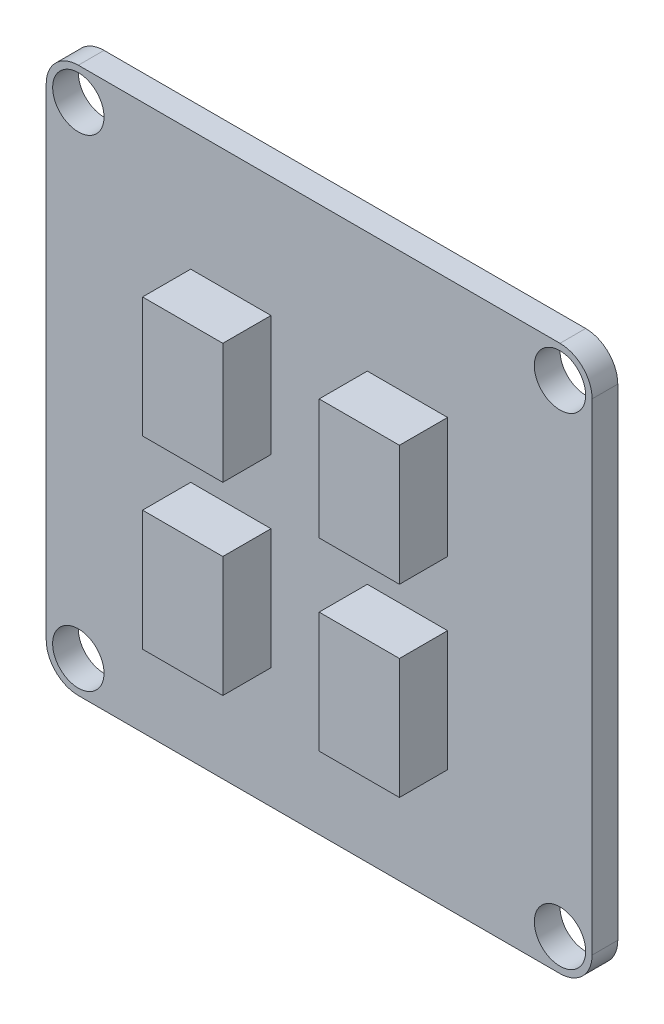
ISO-10303-21;
HEADER;
FILE_DESCRIPTION(('STEP AP214'),'2;1');
FILE_NAME('part.step','',(''),(''),'','','');
FILE_SCHEMA(('AUTOMOTIVE_DESIGN { 1 0 10303 214 1 1 1 1 }'));
ENDSEC;
DATA;
#1=APPLICATION_CONTEXT('core data for automotive mechanical design processes');
#2=APPLICATION_PROTOCOL_DEFINITION('international standard','automotive_design',2000,#1);
#3=PRODUCT_CONTEXT('',#1,'mechanical');
#4=PRODUCT('Part','Part','',(#3));
#5=PRODUCT_RELATED_PRODUCT_CATEGORY('part','',(#4));
#6=PRODUCT_DEFINITION_FORMATION('','',#4);
#7=PRODUCT_DEFINITION_CONTEXT('part definition',#1,'design');
#8=PRODUCT_DEFINITION('design','',#6,#7);
#9=PRODUCT_DEFINITION_SHAPE('','',#8);
#10=(LENGTH_UNIT() NAMED_UNIT(*) SI_UNIT(.MILLI.,.METRE.));
#11=(NAMED_UNIT(*) PLANE_ANGLE_UNIT() SI_UNIT($,.RADIAN.));
#12=(NAMED_UNIT(*) SI_UNIT($,.STERADIAN.) SOLID_ANGLE_UNIT());
#13=UNCERTAINTY_MEASURE_WITH_UNIT(LENGTH_MEASURE(1.E-05),#10,'distance_accuracy_value','');
#14=(GEOMETRIC_REPRESENTATION_CONTEXT(3) GLOBAL_UNCERTAINTY_ASSIGNED_CONTEXT((#13)) GLOBAL_UNIT_ASSIGNED_CONTEXT((#10,
#11,#12)) REPRESENTATION_CONTEXT('',''));
#15=CARTESIAN_POINT('',(0.,0.,0.));
#16=DIRECTION('',(0.,0.,1.));
#17=DIRECTION('',(1.,0.,0.));
#18=AXIS2_PLACEMENT_3D('',#15,#16,#17);
#19=CARTESIAN_POINT('',(-13.2356576243425,11.611622238612,1.6));
#20=DIRECTION('',(0.,0.,1.));
#21=DIRECTION('',(1.,0.,0.));
#22=AXIS2_PLACEMENT_3D('',#19,#20,#21);
#23=PLANE('',#22);
#24=CARTESIAN_POINT('',(-13.2356576243425,11.611622238612,1.6));
#25=DIRECTION('',(0.,0.,1.));
#26=DIRECTION('',(-1.,0.,0.));
#27=AXIS2_PLACEMENT_3D('',#24,#25,#26);
#28=CIRCLE('',#27,1.6);
#29=CARTESIAN_POINT('',(-14.8356576243425,11.611622238612,1.6));
#30=VERTEX_POINT('',#29);
#31=EDGE_CURVE('E318',#30,#30,#28,.T.);
#32=ORIENTED_EDGE('',*,*,#31,.F.);
#33=EDGE_LOOP('',(#32));
#34=FACE_BOUND('',#33,.T.);
#35=CARTESIAN_POINT('',(16.7643423756575,11.611622238612,1.6));
#36=DIRECTION('',(0.,0.,1.));
#37=DIRECTION('',(1.,0.,0.));
#38=AXIS2_PLACEMENT_3D('',#35,#36,#37);
#39=CIRCLE('',#38,1.6);
#40=CARTESIAN_POINT('',(18.3643423756575,11.611622238612,1.6));
#41=VERTEX_POINT('',#40);
#42=EDGE_CURVE('E330',#41,#41,#39,.T.);
#43=ORIENTED_EDGE('',*,*,#42,.F.);
#44=EDGE_LOOP('',(#43));
#45=FACE_BOUND('',#44,.T.);
#46=CARTESIAN_POINT('',(-13.2356576243425,11.611622238612,1.6));
#47=DIRECTION('',(0.,0.,1.));
#48=DIRECTION('',(1.,0.,0.));
#49=AXIS2_PLACEMENT_3D('',#46,#47,#48);
#50=CIRCLE('',#49,2.);
#51=CARTESIAN_POINT('',(-13.2356576243425,13.611622238612,1.6));
#52=VERTEX_POINT('',#51);
#53=CARTESIAN_POINT('',(-15.2356576243425,11.611622238612,1.6));
#54=VERTEX_POINT('',#53);
#55=EDGE_CURVE('E336',#52,#54,#50,.T.);
#56=ORIENTED_EDGE('',*,*,#55,.T.);
#57=DIRECTION('',(0.,-1.,0.));
#58=VECTOR('',#57,1.);
#59=CARTESIAN_POINT('',(-15.2356576243425,11.611622238612,1.6));
#60=LINE('',#59,#58);
#61=CARTESIAN_POINT('',(-15.2356576243425,-18.388377761388,1.6));
#62=VERTEX_POINT('',#61);
#63=EDGE_CURVE('E339',#54,#62,#60,.T.);
#64=ORIENTED_EDGE('',*,*,#63,.T.);
#65=CARTESIAN_POINT('',(-13.2356576243425,-18.388377761388,1.6));
#66=DIRECTION('',(0.,0.,1.));
#67=DIRECTION('',(1.,0.,0.));
#68=AXIS2_PLACEMENT_3D('',#65,#66,#67);
#69=CIRCLE('',#68,2.);
#70=CARTESIAN_POINT('',(-13.2356576243425,-20.388377761388,1.6));
#71=VERTEX_POINT('',#70);
#72=EDGE_CURVE('E342',#62,#71,#69,.T.);
#73=ORIENTED_EDGE('',*,*,#72,.T.);
#74=DIRECTION('',(1.,0.,0.));
#75=VECTOR('',#74,1.);
#76=CARTESIAN_POINT('',(-13.2356576243425,-20.388377761388,1.6));
#77=LINE('',#76,#75);
#78=CARTESIAN_POINT('',(16.7643423756575,-20.388377761388,1.6));
#79=VERTEX_POINT('',#78);
#80=EDGE_CURVE('E344',#71,#79,#77,.T.);
#81=ORIENTED_EDGE('',*,*,#80,.T.);
#82=CARTESIAN_POINT('',(16.7643423756575,-18.388377761388,1.6));
#83=DIRECTION('',(0.,0.,1.));
#84=DIRECTION('',(1.,0.,0.));
#85=AXIS2_PLACEMENT_3D('',#82,#83,#84);
#86=CIRCLE('',#85,2.);
#87=CARTESIAN_POINT('',(18.7643423756575,-18.388377761388,1.6));
#88=VERTEX_POINT('',#87);
#89=EDGE_CURVE('E346',#79,#88,#86,.T.);
#90=ORIENTED_EDGE('',*,*,#89,.T.);
#91=DIRECTION('',(0.,1.,0.));
#92=VECTOR('',#91,1.);
#93=CARTESIAN_POINT('',(18.7643423756575,11.611622238612,1.6));
#94=LINE('',#93,#92);
#95=CARTESIAN_POINT('',(18.7643423756575,11.611622238612,1.6));
#96=VERTEX_POINT('',#95);
#97=EDGE_CURVE('E348',#88,#96,#94,.T.);
#98=ORIENTED_EDGE('',*,*,#97,.T.);
#99=CARTESIAN_POINT('',(16.7643423756575,11.611622238612,1.6));
#100=DIRECTION('',(0.,0.,1.));
#101=DIRECTION('',(-1.,0.,0.));
#102=AXIS2_PLACEMENT_3D('',#99,#100,#101);
#103=CIRCLE('',#102,2.);
#104=CARTESIAN_POINT('',(16.7643423756575,13.611622238612,1.6));
#105=VERTEX_POINT('',#104);
#106=EDGE_CURVE('E350',#96,#105,#103,.T.);
#107=ORIENTED_EDGE('',*,*,#106,.T.);
#108=DIRECTION('',(-1.,0.,0.));
#109=VECTOR('',#108,1.);
#110=CARTESIAN_POINT('',(-13.2356576243425,13.611622238612,1.6));
#111=LINE('',#110,#109);
#112=EDGE_CURVE('E352',#105,#52,#111,.T.);
#113=ORIENTED_EDGE('',*,*,#112,.T.);
#114=EDGE_LOOP('',(#56,#64,#73,#81,#90,#98,#107,#113));
#115=FACE_BOUND('',#114,.T.);
#116=CARTESIAN_POINT('',(16.7643423756575,-18.388377761388,1.6));
#117=DIRECTION('',(0.,0.,1.));
#118=DIRECTION('',(-1.,0.,0.));
#119=AXIS2_PLACEMENT_3D('',#116,#117,#118);
#120=CIRCLE('',#119,1.6);
#121=CARTESIAN_POINT('',(15.1643423756575,-18.388377761388,1.6));
#122=VERTEX_POINT('',#121);
#123=EDGE_CURVE('E324',#122,#122,#120,.T.);
#124=ORIENTED_EDGE('',*,*,#123,.F.);
#125=EDGE_LOOP('',(#124));
#126=FACE_BOUND('',#125,.T.);
#127=CARTESIAN_POINT('',(-13.2356576243425,-18.388377761388,1.6));
#128=DIRECTION('',(0.,0.,1.));
#129=DIRECTION('',(1.,0.,0.));
#130=AXIS2_PLACEMENT_3D('',#127,#128,#129);
#131=CIRCLE('',#130,1.6);
#132=CARTESIAN_POINT('',(-11.6356576243425,-18.388377761388,1.6));
#133=VERTEX_POINT('',#132);
#134=EDGE_CURVE('E312',#133,#133,#131,.T.);
#135=ORIENTED_EDGE('',*,*,#134,.F.);
#136=EDGE_LOOP('',(#135));
#137=FACE_BOUND('',#136,.T.);
#138=DIRECTION('',(-1.,0.,0.));
#139=VECTOR('',#138,1.);
#140=CARTESIAN_POINT('',(9.76434237565751,6.11162223861203,1.6));
#141=LINE('',#140,#139);
#142=CARTESIAN_POINT('',(9.76434237565751,6.11162223861203,1.6));
#143=VERTEX_POINT('',#142);
#144=CARTESIAN_POINT('',(4.76434237565751,6.11162223861203,1.6));
#145=VERTEX_POINT('',#144);
#146=EDGE_CURVE('E296',#143,#145,#141,.T.);
#147=ORIENTED_EDGE('',*,*,#146,.F.);
#148=DIRECTION('',(0.,1.,0.));
#149=VECTOR('',#148,1.);
#150=CARTESIAN_POINT('',(9.76434237565751,6.11162223861203,1.6));
#151=LINE('',#150,#149);
#152=CARTESIAN_POINT('',(9.76434237565751,-1.38837776138797,1.6));
#153=VERTEX_POINT('',#152);
#154=EDGE_CURVE('E282',#153,#143,#151,.T.);
#155=ORIENTED_EDGE('',*,*,#154,.F.);
#156=DIRECTION('',(1.,0.,0.));
#157=VECTOR('',#156,1.);
#158=CARTESIAN_POINT('',(9.76434237565751,-1.38837776138797,1.6));
#159=LINE('',#158,#157);
#160=CARTESIAN_POINT('',(4.76434237565751,-1.38837776138796,1.6));
#161=VERTEX_POINT('',#160);
#162=EDGE_CURVE('E287',#161,#153,#159,.T.);
#163=ORIENTED_EDGE('',*,*,#162,.F.);
#164=DIRECTION('',(0.,-1.,0.));
#165=VECTOR('',#164,1.);
#166=CARTESIAN_POINT('',(4.76434237565751,6.11162223861203,1.6));
#167=LINE('',#166,#165);
#168=EDGE_CURVE('E298',#145,#161,#167,.T.);
#169=ORIENTED_EDGE('',*,*,#168,.F.);
#170=EDGE_LOOP('',(#147,#155,#163,#169));
#171=FACE_BOUND('',#170,.T.);
#172=DIRECTION('',(-1.,0.,0.));
#173=VECTOR('',#172,1.);
#174=CARTESIAN_POINT('',(9.76434237565751,-5.38837776138797,1.6));
#175=LINE('',#174,#173);
#176=CARTESIAN_POINT('',(9.76434237565751,-5.38837776138797,1.6));
#177=VERTEX_POINT('',#176);
#178=CARTESIAN_POINT('',(4.76434237565751,-5.38837776138797,1.6));
#179=VERTEX_POINT('',#178);
#180=EDGE_CURVE('E267',#177,#179,#175,.T.);
#181=ORIENTED_EDGE('',*,*,#180,.F.);
#182=DIRECTION('',(0.,1.,0.));
#183=VECTOR('',#182,1.);
#184=CARTESIAN_POINT('',(9.76434237565751,-5.38837776138797,1.6));
#185=LINE('',#184,#183);
#186=CARTESIAN_POINT('',(9.76434237565751,-12.888377761388,1.6));
#187=VERTEX_POINT('',#186);
#188=EDGE_CURVE('E253',#187,#177,#185,.T.);
#189=ORIENTED_EDGE('',*,*,#188,.F.);
#190=DIRECTION('',(1.,0.,0.));
#191=VECTOR('',#190,1.);
#192=CARTESIAN_POINT('',(9.76434237565751,-12.888377761388,1.6));
#193=LINE('',#192,#191);
#194=CARTESIAN_POINT('',(4.76434237565751,-12.888377761388,1.6));
#195=VERTEX_POINT('',#194);
#196=EDGE_CURVE('E258',#195,#187,#193,.T.);
#197=ORIENTED_EDGE('',*,*,#196,.F.);
#198=DIRECTION('',(0.,-1.,0.));
#199=VECTOR('',#198,1.);
#200=CARTESIAN_POINT('',(4.76434237565751,-5.38837776138797,1.6));
#201=LINE('',#200,#199);
#202=EDGE_CURVE('E269',#179,#195,#201,.T.);
#203=ORIENTED_EDGE('',*,*,#202,.F.);
#204=EDGE_LOOP('',(#181,#189,#197,#203));
#205=FACE_BOUND('',#204,.T.);
#206=DIRECTION('',(0.,-1.,0.));
#207=VECTOR('',#206,1.);
#208=CARTESIAN_POINT('',(-6.23565762434249,-5.38837776138797,1.6));
#209=LINE('',#208,#207);
#210=CARTESIAN_POINT('',(-6.23565762434249,-5.38837776138797,1.6));
#211=VERTEX_POINT('',#210);
#212=CARTESIAN_POINT('',(-6.23565762434249,-12.888377761388,1.6));
#213=VERTEX_POINT('',#212);
#214=EDGE_CURVE('E225',#211,#213,#209,.T.);
#215=ORIENTED_EDGE('',*,*,#214,.F.);
#216=DIRECTION('',(-1.,0.,0.));
#217=VECTOR('',#216,1.);
#218=CARTESIAN_POINT('',(-6.23565762434249,-5.38837776138797,1.6));
#219=LINE('',#218,#217);
#220=CARTESIAN_POINT('',(-1.23565762434249,-5.38837776138797,1.6));
#221=VERTEX_POINT('',#220);
#222=EDGE_CURVE('E222',#221,#211,#219,.T.);
#223=ORIENTED_EDGE('',*,*,#222,.F.);
#224=DIRECTION('',(0.,1.,0.));
#225=VECTOR('',#224,1.);
#226=CARTESIAN_POINT('',(-1.23565762434249,-5.38837776138797,1.6));
#227=LINE('',#226,#225);
#228=CARTESIAN_POINT('',(-1.23565762434249,-12.888377761388,1.6));
#229=VERTEX_POINT('',#228);
#230=EDGE_CURVE('E234',#229,#221,#227,.T.);
#231=ORIENTED_EDGE('',*,*,#230,.F.);
#232=DIRECTION('',(1.,0.,0.));
#233=VECTOR('',#232,1.);
#234=CARTESIAN_POINT('',(-6.23565762434249,-12.888377761388,1.6));
#235=LINE('',#234,#233);
#236=EDGE_CURVE('E242',#213,#229,#235,.T.);
#237=ORIENTED_EDGE('',*,*,#236,.F.);
#238=EDGE_LOOP('',(#215,#223,#231,#237));
#239=FACE_BOUND('',#238,.T.);
#240=DIRECTION('',(0.,-1.,0.));
#241=VECTOR('',#240,1.);
#242=CARTESIAN_POINT('',(-6.23565762434249,6.11162223861203,1.6));
#243=LINE('',#242,#241);
#244=CARTESIAN_POINT('',(-6.23565762434249,6.11162223861203,1.6));
#245=VERTEX_POINT('',#244);
#246=CARTESIAN_POINT('',(-6.23565762434249,-1.38837776138797,1.6));
#247=VERTEX_POINT('',#246);
#248=EDGE_CURVE('E759',#245,#247,#243,.T.);
#249=ORIENTED_EDGE('',*,*,#248,.F.);
#250=DIRECTION('',(-1.,0.,0.));
#251=VECTOR('',#250,1.);
#252=CARTESIAN_POINT('',(-6.23565762434249,6.11162223861203,1.6));
#253=LINE('',#252,#251);
#254=CARTESIAN_POINT('',(-1.23565762434249,6.11162223861203,1.6));
#255=VERTEX_POINT('',#254);
#256=EDGE_CURVE('E220',#255,#245,#253,.T.);
#257=ORIENTED_EDGE('',*,*,#256,.F.);
#258=DIRECTION('',(0.,1.,0.));
#259=VECTOR('',#258,1.);
#260=CARTESIAN_POINT('',(-1.23565762434249,6.11162223861203,1.6));
#261=LINE('',#260,#259);
#262=CARTESIAN_POINT('',(-1.23565762434249,-1.38837776138797,1.6));
#263=VERTEX_POINT('',#262);
#264=EDGE_CURVE('E216',#263,#255,#261,.T.);
#265=ORIENTED_EDGE('',*,*,#264,.F.);
#266=DIRECTION('',(1.,0.,0.));
#267=VECTOR('',#266,1.);
#268=CARTESIAN_POINT('',(-6.23565762434249,-1.38837776138797,1.6));
#269=LINE('',#268,#267);
#270=EDGE_CURVE('E756',#247,#263,#269,.T.);
#271=ORIENTED_EDGE('',*,*,#270,.F.);
#272=EDGE_LOOP('',(#249,#257,#265,#271));
#273=FACE_BOUND('',#272,.T.);
#274=ADVANCED_FACE('F35',(#34,#45,#115,#126,#137,#171,#205,#239,#273),#23,.T.);
#275=CARTESIAN_POINT('',(-13.2356576243425,11.611622238612,0.));
#276=DIRECTION('',(0.,0.,1.));
#277=DIRECTION('',(1.,0.,0.));
#278=AXIS2_PLACEMENT_3D('',#275,#276,#277);
#279=PLANE('',#278);
#280=CARTESIAN_POINT('',(-13.2356576243425,11.611622238612,0.));
#281=DIRECTION('',(0.,0.,1.));
#282=DIRECTION('',(1.,0.,0.));
#283=AXIS2_PLACEMENT_3D('',#280,#281,#282);
#284=CIRCLE('',#283,2.);
#285=CARTESIAN_POINT('',(-13.2356576243425,13.611622238612,0.));
#286=VERTEX_POINT('',#285);
#287=CARTESIAN_POINT('',(-15.2356576243425,11.611622238612,0.));
#288=VERTEX_POINT('',#287);
#289=EDGE_CURVE('E333',#286,#288,#284,.T.);
#290=ORIENTED_EDGE('',*,*,#289,.F.);
#291=DIRECTION('',(-1.,0.,0.));
#292=VECTOR('',#291,1.);
#293=CARTESIAN_POINT('',(-13.2356576243425,13.611622238612,0.));
#294=LINE('',#293,#292);
#295=CARTESIAN_POINT('',(16.7643423756575,13.611622238612,0.));
#296=VERTEX_POINT('',#295);
#297=EDGE_CURVE('E340',#296,#286,#294,.T.);
#298=ORIENTED_EDGE('',*,*,#297,.F.);
#299=CARTESIAN_POINT('',(16.7643423756575,11.611622238612,0.));
#300=DIRECTION('',(0.,0.,1.));
#301=DIRECTION('',(-1.,0.,0.));
#302=AXIS2_PLACEMENT_3D('',#299,#300,#301);
#303=CIRCLE('',#302,2.);
#304=CARTESIAN_POINT('',(18.7643423756575,11.611622238612,0.));
#305=VERTEX_POINT('',#304);
#306=EDGE_CURVE('E367',#305,#296,#303,.T.);
#307=ORIENTED_EDGE('',*,*,#306,.F.);
#308=DIRECTION('',(0.,1.,0.));
#309=VECTOR('',#308,1.);
#310=CARTESIAN_POINT('',(18.7643423756575,11.611622238612,0.));
#311=LINE('',#310,#309);
#312=CARTESIAN_POINT('',(18.7643423756575,-18.388377761388,0.));
#313=VERTEX_POINT('',#312);
#314=EDGE_CURVE('E365',#313,#305,#311,.T.);
#315=ORIENTED_EDGE('',*,*,#314,.F.);
#316=CARTESIAN_POINT('',(16.7643423756575,-18.388377761388,0.));
#317=DIRECTION('',(0.,0.,1.));
#318=DIRECTION('',(1.,0.,0.));
#319=AXIS2_PLACEMENT_3D('',#316,#317,#318);
#320=CIRCLE('',#319,2.);
#321=CARTESIAN_POINT('',(16.7643423756575,-20.388377761388,0.));
#322=VERTEX_POINT('',#321);
#323=EDGE_CURVE('E363',#322,#313,#320,.T.);
#324=ORIENTED_EDGE('',*,*,#323,.F.);
#325=DIRECTION('',(1.,0.,0.));
#326=VECTOR('',#325,1.);
#327=CARTESIAN_POINT('',(-13.2356576243425,-20.388377761388,0.));
#328=LINE('',#327,#326);
#329=CARTESIAN_POINT('',(-13.2356576243425,-20.388377761388,0.));
#330=VERTEX_POINT('',#329);
#331=EDGE_CURVE('E361',#330,#322,#328,.T.);
#332=ORIENTED_EDGE('',*,*,#331,.F.);
#333=CARTESIAN_POINT('',(-13.2356576243425,-18.388377761388,0.));
#334=DIRECTION('',(0.,0.,1.));
#335=DIRECTION('',(1.,0.,0.));
#336=AXIS2_PLACEMENT_3D('',#333,#334,#335);
#337=CIRCLE('',#336,2.);
#338=CARTESIAN_POINT('',(-15.2356576243425,-18.388377761388,0.));
#339=VERTEX_POINT('',#338);
#340=EDGE_CURVE('E359',#339,#330,#337,.T.);
#341=ORIENTED_EDGE('',*,*,#340,.F.);
#342=DIRECTION('',(0.,-1.,0.));
#343=VECTOR('',#342,1.);
#344=CARTESIAN_POINT('',(-15.2356576243425,11.611622238612,0.));
#345=LINE('',#344,#343);
#346=EDGE_CURVE('E357',#288,#339,#345,.T.);
#347=ORIENTED_EDGE('',*,*,#346,.F.);
#348=EDGE_LOOP('',(#290,#298,#307,#315,#324,#332,#341,#347));
#349=FACE_BOUND('',#348,.T.);
#350=CARTESIAN_POINT('',(16.7643423756575,11.611622238612,0.));
#351=DIRECTION('',(0.,0.,1.));
#352=DIRECTION('',(1.,0.,0.));
#353=AXIS2_PLACEMENT_3D('',#350,#351,#352);
#354=CIRCLE('',#353,1.6);
#355=CARTESIAN_POINT('',(18.3643423756575,11.611622238612,0.));
#356=VERTEX_POINT('',#355);
#357=EDGE_CURVE('E327',#356,#356,#354,.T.);
#358=ORIENTED_EDGE('',*,*,#357,.T.);
#359=EDGE_LOOP('',(#358));
#360=FACE_BOUND('',#359,.T.);
#361=CARTESIAN_POINT('',(16.7643423756575,-18.388377761388,0.));
#362=DIRECTION('',(0.,0.,1.));
#363=DIRECTION('',(-1.,0.,0.));
#364=AXIS2_PLACEMENT_3D('',#361,#362,#363);
#365=CIRCLE('',#364,1.6);
#366=CARTESIAN_POINT('',(15.1643423756575,-18.388377761388,0.));
#367=VERTEX_POINT('',#366);
#368=EDGE_CURVE('E321',#367,#367,#365,.T.);
#369=ORIENTED_EDGE('',*,*,#368,.T.);
#370=EDGE_LOOP('',(#369));
#371=FACE_BOUND('',#370,.T.);
#372=CARTESIAN_POINT('',(-13.2356576243425,11.611622238612,0.));
#373=DIRECTION('',(0.,0.,1.));
#374=DIRECTION('',(-1.,0.,0.));
#375=AXIS2_PLACEMENT_3D('',#372,#373,#374);
#376=CIRCLE('',#375,1.6);
#377=CARTESIAN_POINT('',(-14.8356576243425,11.611622238612,0.));
#378=VERTEX_POINT('',#377);
#379=EDGE_CURVE('E315',#378,#378,#376,.T.);
#380=ORIENTED_EDGE('',*,*,#379,.T.);
#381=EDGE_LOOP('',(#380));
#382=FACE_BOUND('',#381,.T.);
#383=CARTESIAN_POINT('',(-13.2356576243425,-18.388377761388,0.));
#384=DIRECTION('',(0.,0.,1.));
#385=DIRECTION('',(1.,0.,0.));
#386=AXIS2_PLACEMENT_3D('',#383,#384,#385);
#387=CIRCLE('',#386,1.6);
#388=CARTESIAN_POINT('',(-11.6356576243425,-18.388377761388,0.));
#389=VERTEX_POINT('',#388);
#390=EDGE_CURVE('E311',#389,#389,#387,.T.);
#391=ORIENTED_EDGE('',*,*,#390,.T.);
#392=EDGE_LOOP('',(#391));
#393=FACE_BOUND('',#392,.T.);
#394=ADVANCED_FACE('F397',(#349,#360,#371,#382,#393),#279,.F.);
#395=CARTESIAN_POINT('',(-13.2356576243425,11.611622238612,1.6));
#396=DIRECTION('',(0.,0.,-1.));
#397=DIRECTION('',(-1.,0.,0.));
#398=AXIS2_PLACEMENT_3D('',#395,#396,#397);
#399=CYLINDRICAL_SURFACE('',#398,2.);
#400=ORIENTED_EDGE('',*,*,#289,.T.);
#401=DIRECTION('',(0.,0.,-1.));
#402=VECTOR('',#401,1.);
#403=CARTESIAN_POINT('',(-15.2356576243425,11.611622238612,1.6));
#404=LINE('',#403,#402);
#405=EDGE_CURVE('E11',#54,#288,#404,.T.);
#406=ORIENTED_EDGE('',*,*,#405,.F.);
#407=ORIENTED_EDGE('',*,*,#55,.F.);
#408=DIRECTION('',(0.,0.,-1.));
#409=VECTOR('',#408,1.);
#410=CARTESIAN_POINT('',(-13.2356576243425,13.611622238612,1.6));
#411=LINE('',#410,#409);
#412=EDGE_CURVE('E354',#52,#286,#411,.T.);
#413=ORIENTED_EDGE('',*,*,#412,.T.);
#414=EDGE_LOOP('',(#400,#406,#407,#413));
#415=FACE_BOUND('',#414,.T.);
#416=ADVANCED_FACE('F37',(#415),#399,.T.);
#417=CARTESIAN_POINT('',(-15.2356576243425,11.611622238612,1.6));
#418=DIRECTION('',(1.,0.,0.));
#419=DIRECTION('',(0.,1.,0.));
#420=AXIS2_PLACEMENT_3D('',#417,#418,#419);
#421=PLANE('',#420);
#422=ORIENTED_EDGE('',*,*,#346,.T.);
#423=DIRECTION('',(0.,0.,-1.));
#424=VECTOR('',#423,1.);
#425=CARTESIAN_POINT('',(-15.2356576243425,-18.388377761388,1.6));
#426=LINE('',#425,#424);
#427=EDGE_CURVE('E43',#62,#339,#426,.T.);
#428=ORIENTED_EDGE('',*,*,#427,.F.);
#429=ORIENTED_EDGE('',*,*,#63,.F.);
#430=ORIENTED_EDGE('',*,*,#405,.T.);
#431=EDGE_LOOP('',(#422,#428,#429,#430));
#432=FACE_BOUND('',#431,.T.);
#433=ADVANCED_FACE('F415',(#432),#421,.F.);
#434=CARTESIAN_POINT('',(-13.2356576243425,-18.388377761388,1.6));
#435=DIRECTION('',(0.,0.,-1.));
#436=DIRECTION('',(-1.,0.,0.));
#437=AXIS2_PLACEMENT_3D('',#434,#435,#436);
#438=CYLINDRICAL_SURFACE('',#437,2.);
#439=ORIENTED_EDGE('',*,*,#340,.T.);
#440=DIRECTION('',(0.,0.,-1.));
#441=VECTOR('',#440,1.);
#442=CARTESIAN_POINT('',(-13.2356576243425,-20.388377761388,1.6));
#443=LINE('',#442,#441);
#444=EDGE_CURVE('E384',#71,#330,#443,.T.);
#445=ORIENTED_EDGE('',*,*,#444,.F.);
#446=ORIENTED_EDGE('',*,*,#72,.F.);
#447=ORIENTED_EDGE('',*,*,#427,.T.);
#448=EDGE_LOOP('',(#439,#445,#446,#447));
#449=FACE_BOUND('',#448,.T.);
#450=ADVANCED_FACE('F391',(#449),#438,.T.);
#451=CARTESIAN_POINT('',(-13.2356576243425,-20.388377761388,1.6));
#452=DIRECTION('',(0.,1.,0.));
#453=DIRECTION('',(0.,0.,1.));
#454=AXIS2_PLACEMENT_3D('',#451,#452,#453);
#455=PLANE('',#454);
#456=ORIENTED_EDGE('',*,*,#331,.T.);
#457=DIRECTION('',(0.,0.,-1.));
#458=VECTOR('',#457,1.);
#459=CARTESIAN_POINT('',(16.7643423756575,-20.388377761388,1.6));
#460=LINE('',#459,#458);
#461=EDGE_CURVE('E381',#79,#322,#460,.T.);
#462=ORIENTED_EDGE('',*,*,#461,.F.);
#463=ORIENTED_EDGE('',*,*,#80,.F.);
#464=ORIENTED_EDGE('',*,*,#444,.T.);
#465=EDGE_LOOP('',(#456,#462,#463,#464));
#466=FACE_BOUND('',#465,.T.);
#467=ADVANCED_FACE('F403',(#466),#455,.F.);
#468=CARTESIAN_POINT('',(16.7643423756575,-18.388377761388,1.6));
#469=DIRECTION('',(0.,0.,-1.));
#470=DIRECTION('',(-1.,0.,0.));
#471=AXIS2_PLACEMENT_3D('',#468,#469,#470);
#472=CYLINDRICAL_SURFACE('',#471,2.);
#473=ORIENTED_EDGE('',*,*,#323,.T.);
#474=DIRECTION('',(0.,0.,-1.));
#475=VECTOR('',#474,1.);
#476=CARTESIAN_POINT('',(18.7643423756575,-18.388377761388,1.6));
#477=LINE('',#476,#475);
#478=EDGE_CURVE('E378',#88,#313,#477,.T.);
#479=ORIENTED_EDGE('',*,*,#478,.F.);
#480=ORIENTED_EDGE('',*,*,#89,.F.);
#481=ORIENTED_EDGE('',*,*,#461,.T.);
#482=EDGE_LOOP('',(#473,#479,#480,#481));
#483=FACE_BOUND('',#482,.T.);
#484=ADVANCED_FACE('F407',(#483),#472,.T.);
#485=CARTESIAN_POINT('',(18.7643423756575,11.611622238612,1.6));
#486=DIRECTION('',(-1.,0.,0.));
#487=DIRECTION('',(0.,0.,1.));
#488=AXIS2_PLACEMENT_3D('',#485,#486,#487);
#489=PLANE('',#488);
#490=ORIENTED_EDGE('',*,*,#314,.T.);
#491=DIRECTION('',(0.,0.,-1.));
#492=VECTOR('',#491,1.);
#493=CARTESIAN_POINT('',(18.7643423756575,11.611622238612,1.6));
#494=LINE('',#493,#492);
#495=EDGE_CURVE('E375',#96,#305,#494,.T.);
#496=ORIENTED_EDGE('',*,*,#495,.F.);
#497=ORIENTED_EDGE('',*,*,#97,.F.);
#498=ORIENTED_EDGE('',*,*,#478,.T.);
#499=EDGE_LOOP('',(#490,#496,#497,#498));
#500=FACE_BOUND('',#499,.T.);
#501=ADVANCED_FACE('F428',(#500),#489,.F.);
#502=CARTESIAN_POINT('',(16.7643423756575,11.611622238612,1.6));
#503=DIRECTION('',(0.,0.,-1.));
#504=DIRECTION('',(-1.,0.,0.));
#505=AXIS2_PLACEMENT_3D('',#502,#503,#504);
#506=CYLINDRICAL_SURFACE('',#505,2.);
#507=ORIENTED_EDGE('',*,*,#306,.T.);
#508=DIRECTION('',(0.,0.,-1.));
#509=VECTOR('',#508,1.);
#510=CARTESIAN_POINT('',(16.7643423756575,13.611622238612,1.6));
#511=LINE('',#510,#509);
#512=EDGE_CURVE('E372',#105,#296,#511,.T.);
#513=ORIENTED_EDGE('',*,*,#512,.F.);
#514=ORIENTED_EDGE('',*,*,#106,.F.);
#515=ORIENTED_EDGE('',*,*,#495,.T.);
#516=EDGE_LOOP('',(#507,#513,#514,#515));
#517=FACE_BOUND('',#516,.T.);
#518=ADVANCED_FACE('F426',(#517),#506,.T.);
#519=CARTESIAN_POINT('',(-13.2356576243425,13.611622238612,1.6));
#520=DIRECTION('',(0.,-1.,0.));
#521=DIRECTION('',(0.,0.,-1.));
#522=AXIS2_PLACEMENT_3D('',#519,#520,#521);
#523=PLANE('',#522);
#524=ORIENTED_EDGE('',*,*,#297,.T.);
#525=ORIENTED_EDGE('',*,*,#412,.F.);
#526=ORIENTED_EDGE('',*,*,#112,.F.);
#527=ORIENTED_EDGE('',*,*,#512,.T.);
#528=EDGE_LOOP('',(#524,#525,#526,#527));
#529=FACE_BOUND('',#528,.T.);
#530=ADVANCED_FACE('F421',(#529),#523,.F.);
#531=CARTESIAN_POINT('',(16.7643423756575,11.611622238612,1.6));
#532=DIRECTION('',(0.,0.,-1.));
#533=DIRECTION('',(-1.,0.,0.));
#534=AXIS2_PLACEMENT_3D('',#531,#532,#533);
#535=CYLINDRICAL_SURFACE('',#534,1.6);
#536=ORIENTED_EDGE('',*,*,#42,.T.);
#537=EDGE_LOOP('',(#536));
#538=FACE_BOUND('',#537,.T.);
#539=ORIENTED_EDGE('',*,*,#357,.F.);
#540=EDGE_LOOP('',(#539));
#541=FACE_BOUND('',#540,.T.);
#542=ADVANCED_FACE('F449',(#538,#541),#535,.F.);
#543=CARTESIAN_POINT('',(16.7643423756575,-18.388377761388,1.6));
#544=DIRECTION('',(0.,0.,-1.));
#545=DIRECTION('',(-1.,0.,0.));
#546=AXIS2_PLACEMENT_3D('',#543,#544,#545);
#547=CYLINDRICAL_SURFACE('',#546,1.6);
#548=ORIENTED_EDGE('',*,*,#123,.T.);
#549=EDGE_LOOP('',(#548));
#550=FACE_BOUND('',#549,.T.);
#551=ORIENTED_EDGE('',*,*,#368,.F.);
#552=EDGE_LOOP('',(#551));
#553=FACE_BOUND('',#552,.T.);
#554=ADVANCED_FACE('F456',(#550,#553),#547,.F.);
#555=CARTESIAN_POINT('',(-13.2356576243425,11.611622238612,1.6));
#556=DIRECTION('',(0.,0.,-1.));
#557=DIRECTION('',(-1.,0.,0.));
#558=AXIS2_PLACEMENT_3D('',#555,#556,#557);
#559=CYLINDRICAL_SURFACE('',#558,1.6);
#560=ORIENTED_EDGE('',*,*,#31,.T.);
#561=EDGE_LOOP('',(#560));
#562=FACE_BOUND('',#561,.T.);
#563=ORIENTED_EDGE('',*,*,#379,.F.);
#564=EDGE_LOOP('',(#563));
#565=FACE_BOUND('',#564,.T.);
#566=ADVANCED_FACE('F461',(#562,#565),#559,.F.);
#567=CARTESIAN_POINT('',(-13.2356576243425,-18.388377761388,1.6));
#568=DIRECTION('',(0.,0.,-1.));
#569=DIRECTION('',(-1.,0.,0.));
#570=AXIS2_PLACEMENT_3D('',#567,#568,#569);
#571=CYLINDRICAL_SURFACE('',#570,1.6);
#572=ORIENTED_EDGE('',*,*,#134,.T.);
#573=EDGE_LOOP('',(#572));
#574=FACE_BOUND('',#573,.T.);
#575=ORIENTED_EDGE('',*,*,#390,.F.);
#576=EDGE_LOOP('',(#575));
#577=FACE_BOUND('',#576,.T.);
#578=ADVANCED_FACE('F473',(#574,#577),#571,.F.);
#579=CARTESIAN_POINT('',(9.76434237565751,6.11162223861203,4.6));
#580=DIRECTION('',(-1.,0.,0.));
#581=DIRECTION('',(0.,-1.,0.));
#582=AXIS2_PLACEMENT_3D('',#579,#580,#581);
#583=PLANE('',#582);
#584=ORIENTED_EDGE('',*,*,#154,.T.);
#585=DIRECTION('',(0.,0.,-1.));
#586=VECTOR('',#585,1.);
#587=CARTESIAN_POINT('',(9.76434237565751,6.11162223861203,4.6));
#588=LINE('',#587,#586);
#589=CARTESIAN_POINT('',(9.76434237565751,6.11162223861203,4.6));
#590=VERTEX_POINT('',#589);
#591=EDGE_CURVE('E309',#590,#143,#588,.T.);
#592=ORIENTED_EDGE('',*,*,#591,.F.);
#593=DIRECTION('',(0.,1.,0.));
#594=VECTOR('',#593,1.);
#595=CARTESIAN_POINT('',(9.76434237565751,6.11162223861203,4.6));
#596=LINE('',#595,#594);
#597=CARTESIAN_POINT('',(9.76434237565751,-1.38837776138797,4.6));
#598=VERTEX_POINT('',#597);
#599=EDGE_CURVE('E283',#598,#590,#596,.T.);
#600=ORIENTED_EDGE('',*,*,#599,.F.);
#601=DIRECTION('',(0.,0.,-1.));
#602=VECTOR('',#601,1.);
#603=CARTESIAN_POINT('',(9.76434237565751,-1.38837776138797,4.6));
#604=LINE('',#603,#602);
#605=EDGE_CURVE('E293',#598,#153,#604,.T.);
#606=ORIENTED_EDGE('',*,*,#605,.T.);
#607=EDGE_LOOP('',(#584,#592,#600,#606));
#608=FACE_BOUND('',#607,.T.);
#609=ADVANCED_FACE('F475',(#608),#583,.F.);
#610=CARTESIAN_POINT('',(9.76434237565751,6.11162223861203,4.6));
#611=DIRECTION('',(0.,-1.,0.));
#612=DIRECTION('',(1.,0.,0.));
#613=AXIS2_PLACEMENT_3D('',#610,#611,#612);
#614=PLANE('',#613);
#615=ORIENTED_EDGE('',*,*,#146,.T.);
#616=DIRECTION('',(0.,0.,-1.));
#617=VECTOR('',#616,1.);
#618=CARTESIAN_POINT('',(4.76434237565751,6.11162223861203,4.6));
#619=LINE('',#618,#617);
#620=CARTESIAN_POINT('',(4.76434237565751,6.11162223861203,4.6));
#621=VERTEX_POINT('',#620);
#622=EDGE_CURVE('E306',#621,#145,#619,.T.);
#623=ORIENTED_EDGE('',*,*,#622,.F.);
#624=DIRECTION('',(-1.,0.,0.));
#625=VECTOR('',#624,1.);
#626=CARTESIAN_POINT('',(9.76434237565751,6.11162223861203,4.6));
#627=LINE('',#626,#625);
#628=EDGE_CURVE('E286',#590,#621,#627,.T.);
#629=ORIENTED_EDGE('',*,*,#628,.F.);
#630=ORIENTED_EDGE('',*,*,#591,.T.);
#631=EDGE_LOOP('',(#615,#623,#629,#630));
#632=FACE_BOUND('',#631,.T.);
#633=ADVANCED_FACE('F481',(#632),#614,.F.);
#634=CARTESIAN_POINT('',(4.76434237565751,6.11162223861203,4.6));
#635=DIRECTION('',(1.,0.,0.));
#636=DIRECTION('',(0.,0.,-1.));
#637=AXIS2_PLACEMENT_3D('',#634,#635,#636);
#638=PLANE('',#637);
#639=ORIENTED_EDGE('',*,*,#168,.T.);
#640=DIRECTION('',(0.,0.,-1.));
#641=VECTOR('',#640,1.);
#642=CARTESIAN_POINT('',(4.76434237565751,-1.38837776138797,4.6));
#643=LINE('',#642,#641);
#644=CARTESIAN_POINT('',(4.76434237565751,-1.38837776138797,4.6));
#645=VERTEX_POINT('',#644);
#646=EDGE_CURVE('E304',#645,#161,#643,.T.);
#647=ORIENTED_EDGE('',*,*,#646,.F.);
#648=DIRECTION('',(0.,-1.,0.));
#649=VECTOR('',#648,1.);
#650=CARTESIAN_POINT('',(4.76434237565751,6.11162223861203,4.6));
#651=LINE('',#650,#649);
#652=EDGE_CURVE('E289',#621,#645,#651,.T.);
#653=ORIENTED_EDGE('',*,*,#652,.F.);
#654=ORIENTED_EDGE('',*,*,#622,.T.);
#655=EDGE_LOOP('',(#639,#647,#653,#654));
#656=FACE_BOUND('',#655,.T.);
#657=ADVANCED_FACE('F489',(#656),#638,.F.);
#658=CARTESIAN_POINT('',(9.76434237565751,-1.38837776138797,4.6));
#659=DIRECTION('',(0.,1.,0.));
#660=DIRECTION('',(-1.,0.,0.));
#661=AXIS2_PLACEMENT_3D('',#658,#659,#660);
#662=PLANE('',#661);
#663=ORIENTED_EDGE('',*,*,#162,.T.);
#664=ORIENTED_EDGE('',*,*,#605,.F.);
#665=DIRECTION('',(1.,0.,0.));
#666=VECTOR('',#665,1.);
#667=CARTESIAN_POINT('',(9.76434237565751,-1.38837776138797,4.6));
#668=LINE('',#667,#666);
#669=EDGE_CURVE('E291',#645,#598,#668,.T.);
#670=ORIENTED_EDGE('',*,*,#669,.F.);
#671=ORIENTED_EDGE('',*,*,#646,.T.);
#672=EDGE_LOOP('',(#663,#664,#670,#671));
#673=FACE_BOUND('',#672,.T.);
#674=ADVANCED_FACE('F493',(#673),#662,.F.);
#675=CARTESIAN_POINT('',(0.,0.,4.6));
#676=DIRECTION('',(0.,0.,-1.));
#677=DIRECTION('',(-1.,0.,0.));
#678=AXIS2_PLACEMENT_3D('',#675,#676,#677);
#679=PLANE('',#678);
#680=ORIENTED_EDGE('',*,*,#599,.T.);
#681=ORIENTED_EDGE('',*,*,#628,.T.);
#682=ORIENTED_EDGE('',*,*,#652,.T.);
#683=ORIENTED_EDGE('',*,*,#669,.T.);
#684=EDGE_LOOP('',(#680,#681,#682,#683));
#685=FACE_BOUND('',#684,.T.);
#686=ADVANCED_FACE('F497',(#685),#679,.F.);
#687=CARTESIAN_POINT('',(9.76434237565751,-5.38837776138797,4.6));
#688=DIRECTION('',(-1.,0.,0.));
#689=DIRECTION('',(0.,0.,1.));
#690=AXIS2_PLACEMENT_3D('',#687,#688,#689);
#691=PLANE('',#690);
#692=ORIENTED_EDGE('',*,*,#188,.T.);
#693=DIRECTION('',(0.,0.,-1.));
#694=VECTOR('',#693,1.);
#695=CARTESIAN_POINT('',(9.76434237565751,-5.38837776138797,4.6));
#696=LINE('',#695,#694);
#697=CARTESIAN_POINT('',(9.76434237565751,-5.38837776138797,4.6));
#698=VERTEX_POINT('',#697);
#699=EDGE_CURVE('E280',#698,#177,#696,.T.);
#700=ORIENTED_EDGE('',*,*,#699,.F.);
#701=DIRECTION('',(0.,1.,0.));
#702=VECTOR('',#701,1.);
#703=CARTESIAN_POINT('',(9.76434237565751,-5.38837776138797,4.6));
#704=LINE('',#703,#702);
#705=CARTESIAN_POINT('',(9.76434237565751,-12.888377761388,4.6));
#706=VERTEX_POINT('',#705);
#707=EDGE_CURVE('E254',#706,#698,#704,.T.);
#708=ORIENTED_EDGE('',*,*,#707,.F.);
#709=DIRECTION('',(0.,0.,-1.));
#710=VECTOR('',#709,1.);
#711=CARTESIAN_POINT('',(9.76434237565751,-12.888377761388,4.6));
#712=LINE('',#711,#710);
#713=EDGE_CURVE('E264',#706,#187,#712,.T.);
#714=ORIENTED_EDGE('',*,*,#713,.T.);
#715=EDGE_LOOP('',(#692,#700,#708,#714));
#716=FACE_BOUND('',#715,.T.);
#717=ADVANCED_FACE('F501',(#716),#691,.F.);
#718=CARTESIAN_POINT('',(9.76434237565751,-5.38837776138797,4.6));
#719=DIRECTION('',(0.,-1.,0.));
#720=DIRECTION('',(1.,0.,0.));
#721=AXIS2_PLACEMENT_3D('',#718,#719,#720);
#722=PLANE('',#721);
#723=ORIENTED_EDGE('',*,*,#180,.T.);
#724=DIRECTION('',(0.,0.,-1.));
#725=VECTOR('',#724,1.);
#726=CARTESIAN_POINT('',(4.76434237565751,-5.38837776138797,4.6));
#727=LINE('',#726,#725);
#728=CARTESIAN_POINT('',(4.76434237565751,-5.38837776138797,4.6));
#729=VERTEX_POINT('',#728);
#730=EDGE_CURVE('E277',#729,#179,#727,.T.);
#731=ORIENTED_EDGE('',*,*,#730,.F.);
#732=DIRECTION('',(-1.,0.,0.));
#733=VECTOR('',#732,1.);
#734=CARTESIAN_POINT('',(9.76434237565751,-5.38837776138797,4.6));
#735=LINE('',#734,#733);
#736=EDGE_CURVE('E257',#698,#729,#735,.T.);
#737=ORIENTED_EDGE('',*,*,#736,.F.);
#738=ORIENTED_EDGE('',*,*,#699,.T.);
#739=EDGE_LOOP('',(#723,#731,#737,#738));
#740=FACE_BOUND('',#739,.T.);
#741=ADVANCED_FACE('F505',(#740),#722,.F.);
#742=CARTESIAN_POINT('',(4.76434237565751,-5.38837776138797,4.6));
#743=DIRECTION('',(1.,0.,0.));
#744=DIRECTION('',(0.,0.,-1.));
#745=AXIS2_PLACEMENT_3D('',#742,#743,#744);
#746=PLANE('',#745);
#747=ORIENTED_EDGE('',*,*,#202,.T.);
#748=DIRECTION('',(0.,0.,-1.));
#749=VECTOR('',#748,1.);
#750=CARTESIAN_POINT('',(4.76434237565751,-12.888377761388,4.6));
#751=LINE('',#750,#749);
#752=CARTESIAN_POINT('',(4.76434237565751,-12.888377761388,4.6));
#753=VERTEX_POINT('',#752);
#754=EDGE_CURVE('E275',#753,#195,#751,.T.);
#755=ORIENTED_EDGE('',*,*,#754,.F.);
#756=DIRECTION('',(0.,-1.,0.));
#757=VECTOR('',#756,1.);
#758=CARTESIAN_POINT('',(4.76434237565751,-5.38837776138797,4.6));
#759=LINE('',#758,#757);
#760=EDGE_CURVE('E260',#729,#753,#759,.T.);
#761=ORIENTED_EDGE('',*,*,#760,.F.);
#762=ORIENTED_EDGE('',*,*,#730,.T.);
#763=EDGE_LOOP('',(#747,#755,#761,#762));
#764=FACE_BOUND('',#763,.T.);
#765=ADVANCED_FACE('F509',(#764),#746,.F.);
#766=CARTESIAN_POINT('',(9.76434237565751,-12.888377761388,4.6));
#767=DIRECTION('',(0.,1.,0.));
#768=DIRECTION('',(-1.,0.,0.));
#769=AXIS2_PLACEMENT_3D('',#766,#767,#768);
#770=PLANE('',#769);
#771=ORIENTED_EDGE('',*,*,#196,.T.);
#772=ORIENTED_EDGE('',*,*,#713,.F.);
#773=DIRECTION('',(1.,0.,0.));
#774=VECTOR('',#773,1.);
#775=CARTESIAN_POINT('',(9.76434237565751,-12.888377761388,4.6));
#776=LINE('',#775,#774);
#777=EDGE_CURVE('E262',#753,#706,#776,.T.);
#778=ORIENTED_EDGE('',*,*,#777,.F.);
#779=ORIENTED_EDGE('',*,*,#754,.T.);
#780=EDGE_LOOP('',(#771,#772,#778,#779));
#781=FACE_BOUND('',#780,.T.);
#782=ADVANCED_FACE('F513',(#781),#770,.F.);
#783=CARTESIAN_POINT('',(0.,0.,4.6));
#784=DIRECTION('',(0.,0.,-1.));
#785=DIRECTION('',(-1.,0.,0.));
#786=AXIS2_PLACEMENT_3D('',#783,#784,#785);
#787=PLANE('',#786);
#788=ORIENTED_EDGE('',*,*,#707,.T.);
#789=ORIENTED_EDGE('',*,*,#736,.T.);
#790=ORIENTED_EDGE('',*,*,#760,.T.);
#791=ORIENTED_EDGE('',*,*,#777,.T.);
#792=EDGE_LOOP('',(#788,#789,#790,#791));
#793=FACE_BOUND('',#792,.T.);
#794=ADVANCED_FACE('F517',(#793),#787,.F.);
#795=CARTESIAN_POINT('',(-6.23565762434249,-5.38837776138797,4.6));
#796=DIRECTION('',(0.,-1.,0.));
#797=DIRECTION('',(1.,0.,0.));
#798=AXIS2_PLACEMENT_3D('',#795,#796,#797);
#799=PLANE('',#798);
#800=ORIENTED_EDGE('',*,*,#222,.T.);
#801=DIRECTION('',(0.,0.,-1.));
#802=VECTOR('',#801,1.);
#803=CARTESIAN_POINT('',(-6.23565762434249,-5.38837776138797,4.6));
#804=LINE('',#803,#802);
#805=CARTESIAN_POINT('',(-6.23565762434249,-5.38837776138797,4.6));
#806=VERTEX_POINT('',#805);
#807=EDGE_CURVE('E251',#806,#211,#804,.T.);
#808=ORIENTED_EDGE('',*,*,#807,.F.);
#809=DIRECTION('',(-1.,0.,0.));
#810=VECTOR('',#809,1.);
#811=CARTESIAN_POINT('',(-6.23565762434249,-5.38837776138797,4.6));
#812=LINE('',#811,#810);
#813=CARTESIAN_POINT('',(-1.23565762434249,-5.38837776138797,4.6));
#814=VERTEX_POINT('',#813);
#815=EDGE_CURVE('E230',#814,#806,#812,.T.);
#816=ORIENTED_EDGE('',*,*,#815,.F.);
#817=DIRECTION('',(0.,0.,-1.));
#818=VECTOR('',#817,1.);
#819=CARTESIAN_POINT('',(-1.23565762434249,-5.38837776138797,4.6));
#820=LINE('',#819,#818);
#821=EDGE_CURVE('E239',#814,#221,#820,.T.);
#822=ORIENTED_EDGE('',*,*,#821,.T.);
#823=EDGE_LOOP('',(#800,#808,#816,#822));
#824=FACE_BOUND('',#823,.T.);
#825=ADVANCED_FACE('F521',(#824),#799,.F.);
#826=CARTESIAN_POINT('',(-6.23565762434249,-5.38837776138797,4.6));
#827=DIRECTION('',(1.,0.,0.));
#828=DIRECTION('',(0.,1.,0.));
#829=AXIS2_PLACEMENT_3D('',#826,#827,#828);
#830=PLANE('',#829);
#831=ORIENTED_EDGE('',*,*,#214,.T.);
#832=DIRECTION('',(0.,0.,-1.));
#833=VECTOR('',#832,1.);
#834=CARTESIAN_POINT('',(-6.23565762434249,-12.888377761388,4.6));
#835=LINE('',#834,#833);
#836=CARTESIAN_POINT('',(-6.23565762434249,-12.888377761388,4.6));
#837=VERTEX_POINT('',#836);
#838=EDGE_CURVE('E248',#837,#213,#835,.T.);
#839=ORIENTED_EDGE('',*,*,#838,.F.);
#840=DIRECTION('',(0.,-1.,0.));
#841=VECTOR('',#840,1.);
#842=CARTESIAN_POINT('',(-6.23565762434249,-5.38837776138797,4.6));
#843=LINE('',#842,#841);
#844=EDGE_CURVE('E233',#806,#837,#843,.T.);
#845=ORIENTED_EDGE('',*,*,#844,.F.);
#846=ORIENTED_EDGE('',*,*,#807,.T.);
#847=EDGE_LOOP('',(#831,#839,#845,#846));
#848=FACE_BOUND('',#847,.T.);
#849=ADVANCED_FACE('F525',(#848),#830,.F.);
#850=CARTESIAN_POINT('',(-6.23565762434249,-12.888377761388,4.6));
#851=DIRECTION('',(0.,1.,0.));
#852=DIRECTION('',(-1.,0.,0.));
#853=AXIS2_PLACEMENT_3D('',#850,#851,#852);
#854=PLANE('',#853);
#855=ORIENTED_EDGE('',*,*,#236,.T.);
#856=DIRECTION('',(0.,0.,-1.));
#857=VECTOR('',#856,1.);
#858=CARTESIAN_POINT('',(-1.23565762434249,-12.888377761388,4.6));
#859=LINE('',#858,#857);
#860=CARTESIAN_POINT('',(-1.23565762434249,-12.888377761388,4.6));
#861=VERTEX_POINT('',#860);
#862=EDGE_CURVE('E58',#861,#229,#859,.T.);
#863=ORIENTED_EDGE('',*,*,#862,.F.);
#864=DIRECTION('',(1.,0.,0.));
#865=VECTOR('',#864,1.);
#866=CARTESIAN_POINT('',(-6.23565762434249,-12.888377761388,4.6));
#867=LINE('',#866,#865);
#868=EDGE_CURVE('E236',#837,#861,#867,.T.);
#869=ORIENTED_EDGE('',*,*,#868,.F.);
#870=ORIENTED_EDGE('',*,*,#838,.T.);
#871=EDGE_LOOP('',(#855,#863,#869,#870));
#872=FACE_BOUND('',#871,.T.);
#873=ADVANCED_FACE('F529',(#872),#854,.F.);
#874=CARTESIAN_POINT('',(-1.23565762434249,-5.38837776138797,4.6));
#875=DIRECTION('',(-1.,0.,0.));
#876=DIRECTION('',(0.,-1.,0.));
#877=AXIS2_PLACEMENT_3D('',#874,#875,#876);
#878=PLANE('',#877);
#879=ORIENTED_EDGE('',*,*,#230,.T.);
#880=ORIENTED_EDGE('',*,*,#821,.F.);
#881=DIRECTION('',(0.,1.,0.));
#882=VECTOR('',#881,1.);
#883=CARTESIAN_POINT('',(-1.23565762434249,-5.38837776138797,4.6));
#884=LINE('',#883,#882);
#885=EDGE_CURVE('E238',#861,#814,#884,.T.);
#886=ORIENTED_EDGE('',*,*,#885,.F.);
#887=ORIENTED_EDGE('',*,*,#862,.T.);
#888=EDGE_LOOP('',(#879,#880,#886,#887));
#889=FACE_BOUND('',#888,.T.);
#890=ADVANCED_FACE('F533',(#889),#878,.F.);
#891=CARTESIAN_POINT('',(0.,0.,4.6));
#892=DIRECTION('',(0.,0.,-1.));
#893=DIRECTION('',(-1.,0.,0.));
#894=AXIS2_PLACEMENT_3D('',#891,#892,#893);
#895=PLANE('',#894);
#896=ORIENTED_EDGE('',*,*,#815,.T.);
#897=ORIENTED_EDGE('',*,*,#844,.T.);
#898=ORIENTED_EDGE('',*,*,#868,.T.);
#899=ORIENTED_EDGE('',*,*,#885,.T.);
#900=EDGE_LOOP('',(#896,#897,#898,#899));
#901=FACE_BOUND('',#900,.T.);
#902=ADVANCED_FACE('F537',(#901),#895,.F.);
#903=CARTESIAN_POINT('',(-6.23565762434249,6.11162223861203,4.6));
#904=DIRECTION('',(0.,-1.,0.));
#905=DIRECTION('',(1.,0.,0.));
#906=AXIS2_PLACEMENT_3D('',#903,#904,#905);
#907=PLANE('',#906);
#908=ORIENTED_EDGE('',*,*,#256,.T.);
#909=DIRECTION('',(0.,0.,-1.));
#910=VECTOR('',#909,1.);
#911=CARTESIAN_POINT('',(-6.23565762434249,6.11162223861203,4.6));
#912=LINE('',#911,#910);
#913=CARTESIAN_POINT('',(-6.23565762434249,6.11162223861203,4.6));
#914=VERTEX_POINT('',#913);
#915=EDGE_CURVE('E201',#914,#245,#912,.T.);
#916=ORIENTED_EDGE('',*,*,#915,.F.);
#917=DIRECTION('',(-1.,0.,0.));
#918=VECTOR('',#917,1.);
#919=CARTESIAN_POINT('',(-6.23565762434249,6.11162223861203,4.6));
#920=LINE('',#919,#918);
#921=CARTESIAN_POINT('',(-1.23565762434249,6.11162223861203,4.6));
#922=VERTEX_POINT('',#921);
#923=EDGE_CURVE('E208',#922,#914,#920,.T.);
#924=ORIENTED_EDGE('',*,*,#923,.F.);
#925=DIRECTION('',(0.,0.,-1.));
#926=VECTOR('',#925,1.);
#927=CARTESIAN_POINT('',(-1.23565762434249,6.11162223861203,4.6));
#928=LINE('',#927,#926);
#929=EDGE_CURVE('E753',#922,#255,#928,.T.);
#930=ORIENTED_EDGE('',*,*,#929,.T.);
#931=EDGE_LOOP('',(#908,#916,#924,#930));
#932=FACE_BOUND('',#931,.T.);
#933=ADVANCED_FACE('F218',(#932),#907,.F.);
#934=CARTESIAN_POINT('',(-6.23565762434249,6.11162223861203,4.6));
#935=DIRECTION('',(1.,0.,0.));
#936=DIRECTION('',(0.,1.,0.));
#937=AXIS2_PLACEMENT_3D('',#934,#935,#936);
#938=PLANE('',#937);
#939=ORIENTED_EDGE('',*,*,#248,.T.);
#940=DIRECTION('',(0.,0.,-1.));
#941=VECTOR('',#940,1.);
#942=CARTESIAN_POINT('',(-6.23565762434249,-1.38837776138797,4.6));
#943=LINE('',#942,#941);
#944=CARTESIAN_POINT('',(-6.23565762434249,-1.38837776138797,4.6));
#945=VERTEX_POINT('',#944);
#946=EDGE_CURVE('E204',#945,#247,#943,.T.);
#947=ORIENTED_EDGE('',*,*,#946,.F.);
#948=DIRECTION('',(0.,-1.,0.));
#949=VECTOR('',#948,1.);
#950=CARTESIAN_POINT('',(-6.23565762434249,6.11162223861203,4.6));
#951=LINE('',#950,#949);
#952=EDGE_CURVE('E197',#914,#945,#951,.T.);
#953=ORIENTED_EDGE('',*,*,#952,.F.);
#954=ORIENTED_EDGE('',*,*,#915,.T.);
#955=EDGE_LOOP('',(#939,#947,#953,#954));
#956=FACE_BOUND('',#955,.T.);
#957=ADVANCED_FACE('F199',(#956),#938,.F.);
#958=CARTESIAN_POINT('',(-6.23565762434249,-1.38837776138797,4.6));
#959=DIRECTION('',(0.,1.,0.));
#960=DIRECTION('',(-1.,0.,0.));
#961=AXIS2_PLACEMENT_3D('',#958,#959,#960);
#962=PLANE('',#961);
#963=ORIENTED_EDGE('',*,*,#270,.T.);
#964=DIRECTION('',(0.,0.,-1.));
#965=VECTOR('',#964,1.);
#966=CARTESIAN_POINT('',(-1.23565762434249,-1.38837776138797,4.6));
#967=LINE('',#966,#965);
#968=CARTESIAN_POINT('',(-1.23565762434249,-1.38837776138797,4.6));
#969=VERTEX_POINT('',#968);
#970=EDGE_CURVE('E50',#969,#263,#967,.T.);
#971=ORIENTED_EDGE('',*,*,#970,.F.);
#972=DIRECTION('',(1.,0.,0.));
#973=VECTOR('',#972,1.);
#974=CARTESIAN_POINT('',(-6.23565762434249,-1.38837776138797,4.6));
#975=LINE('',#974,#973);
#976=EDGE_CURVE('E207',#945,#969,#975,.T.);
#977=ORIENTED_EDGE('',*,*,#976,.F.);
#978=ORIENTED_EDGE('',*,*,#946,.T.);
#979=EDGE_LOOP('',(#963,#971,#977,#978));
#980=FACE_BOUND('',#979,.T.);
#981=ADVANCED_FACE('F545',(#980),#962,.F.);
#982=CARTESIAN_POINT('',(-1.23565762434249,6.11162223861203,4.6));
#983=DIRECTION('',(-1.,0.,0.));
#984=DIRECTION('',(0.,-1.,0.));
#985=AXIS2_PLACEMENT_3D('',#982,#983,#984);
#986=PLANE('',#985);
#987=ORIENTED_EDGE('',*,*,#264,.T.);
#988=ORIENTED_EDGE('',*,*,#929,.F.);
#989=DIRECTION('',(0.,1.,0.));
#990=VECTOR('',#989,1.);
#991=CARTESIAN_POINT('',(-1.23565762434249,6.11162223861203,4.6));
#992=LINE('',#991,#990);
#993=EDGE_CURVE('E212',#969,#922,#992,.T.);
#994=ORIENTED_EDGE('',*,*,#993,.F.);
#995=ORIENTED_EDGE('',*,*,#970,.T.);
#996=EDGE_LOOP('',(#987,#988,#994,#995));
#997=FACE_BOUND('',#996,.T.);
#998=ADVANCED_FACE('F548',(#997),#986,.F.);
#999=CARTESIAN_POINT('',(0.,0.,4.6));
#1000=DIRECTION('',(0.,0.,-1.));
#1001=DIRECTION('',(-1.,0.,0.));
#1002=AXIS2_PLACEMENT_3D('',#999,#1000,#1001);
#1003=PLANE('',#1002);
#1004=ORIENTED_EDGE('',*,*,#923,.T.);
#1005=ORIENTED_EDGE('',*,*,#952,.T.);
#1006=ORIENTED_EDGE('',*,*,#976,.T.);
#1007=ORIENTED_EDGE('',*,*,#993,.T.);
#1008=EDGE_LOOP('',(#1004,#1005,#1006,#1007));
#1009=FACE_BOUND('',#1008,.T.);
#1010=ADVANCED_FACE('F211',(#1009),#1003,.F.);
#1011=CLOSED_SHELL('',(#274,#394,#416,#433,#450,#467,#484,#501,#518,#530,#542,#554,#566,#578,
#609,#633,#657,#674,#686,#717,#741,#765,#782,#794,#825,#849,#873,#890,#902,#933,#957,#981,#998,#1010));
#1012=MANIFOLD_SOLID_BREP('B2',#1011);
#1013=ADVANCED_BREP_SHAPE_REPRESENTATION('',(#18,#1012),#14);
#1014=SHAPE_DEFINITION_REPRESENTATION(#9,#1013);
ENDSEC;
END-ISO-10303-21;
